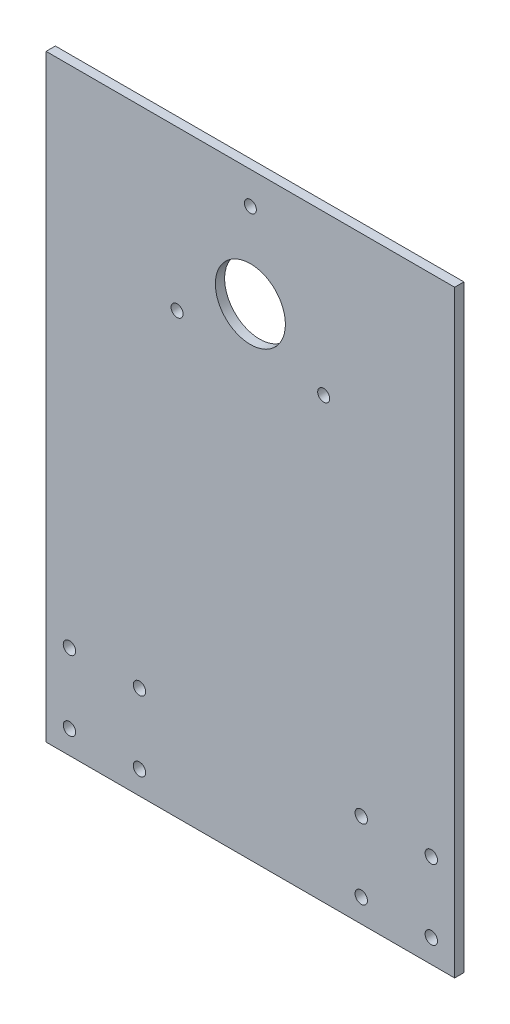
ISO-10303-21;
HEADER;
FILE_DESCRIPTION(('STEP AP214'),'2;1');
FILE_NAME('part.step','',(''),(''),'','','');
FILE_SCHEMA(('AUTOMOTIVE_DESIGN { 1 0 10303 214 1 1 1 1 }'));
ENDSEC;
DATA;
#1=APPLICATION_CONTEXT('core data for automotive mechanical design processes');
#2=APPLICATION_PROTOCOL_DEFINITION('international standard','automotive_design',2000,#1);
#3=PRODUCT_CONTEXT('',#1,'mechanical');
#4=PRODUCT('Part','Part','',(#3));
#5=PRODUCT_RELATED_PRODUCT_CATEGORY('part','',(#4));
#6=PRODUCT_DEFINITION_FORMATION('','',#4);
#7=PRODUCT_DEFINITION_CONTEXT('part definition',#1,'design');
#8=PRODUCT_DEFINITION('design','',#6,#7);
#9=PRODUCT_DEFINITION_SHAPE('','',#8);
#10=(LENGTH_UNIT() NAMED_UNIT(*) SI_UNIT(.MILLI.,.METRE.));
#11=(NAMED_UNIT(*) PLANE_ANGLE_UNIT() SI_UNIT($,.RADIAN.));
#12=(NAMED_UNIT(*) SI_UNIT($,.STERADIAN.) SOLID_ANGLE_UNIT());
#13=UNCERTAINTY_MEASURE_WITH_UNIT(LENGTH_MEASURE(1.E-05),#10,'distance_accuracy_value','');
#14=(GEOMETRIC_REPRESENTATION_CONTEXT(3) GLOBAL_UNCERTAINTY_ASSIGNED_CONTEXT((#13)) GLOBAL_UNIT_ASSIGNED_CONTEXT((#10,
#11,#12)) REPRESENTATION_CONTEXT('',''));
#15=CARTESIAN_POINT('',(0.,0.,0.));
#16=DIRECTION('',(0.,0.,1.));
#17=DIRECTION('',(1.,0.,0.));
#18=AXIS2_PLACEMENT_3D('',#15,#16,#17);
#19=CARTESIAN_POINT('',(0.,0.,3.175));
#20=DIRECTION('',(0.,0.,-1.));
#21=DIRECTION('',(-1.,0.,0.));
#22=AXIS2_PLACEMENT_3D('',#19,#20,#21);
#23=PLANE('',#22);
#24=DIRECTION('',(0.,1.,0.));
#25=VECTOR('',#24,1.);
#26=CARTESIAN_POINT('',(70.,-102.5,3.175));
#27=LINE('',#26,#25);
#28=CARTESIAN_POINT('',(70.,-102.5,3.175));
#29=VERTEX_POINT('',#28);
#30=CARTESIAN_POINT('',(70.,102.5,3.175));
#31=VERTEX_POINT('',#30);
#32=EDGE_CURVE('E98',#29,#31,#27,.T.);
#33=ORIENTED_EDGE('',*,*,#32,.T.);
#34=DIRECTION('',(-1.,0.,0.));
#35=VECTOR('',#34,1.);
#36=CARTESIAN_POINT('',(-70.,102.5,3.175));
#37=LINE('',#36,#35);
#38=CARTESIAN_POINT('',(-70.,102.5,3.175));
#39=VERTEX_POINT('',#38);
#40=EDGE_CURVE('E93',#31,#39,#37,.T.);
#41=ORIENTED_EDGE('',*,*,#40,.T.);
#42=DIRECTION('',(0.,-1.,0.));
#43=VECTOR('',#42,1.);
#44=CARTESIAN_POINT('',(-70.,-102.5,3.175));
#45=LINE('',#44,#43);
#46=CARTESIAN_POINT('',(-70.,-102.5,3.175));
#47=VERTEX_POINT('',#46);
#48=EDGE_CURVE('E96',#39,#47,#45,.T.);
#49=ORIENTED_EDGE('',*,*,#48,.T.);
#50=DIRECTION('',(1.,0.,0.));
#51=VECTOR('',#50,1.);
#52=CARTESIAN_POINT('',(-70.,-102.5,3.175));
#53=LINE('',#52,#51);
#54=EDGE_CURVE('E63',#47,#29,#53,.T.);
#55=ORIENTED_EDGE('',*,*,#54,.T.);
#56=EDGE_LOOP('',(#33,#41,#49,#55));
#57=FACE_BOUND('',#56,.T.);
#58=CARTESIAN_POINT('',(0.,91.5,3.175));
#59=DIRECTION('',(0.,0.,1.));
#60=DIRECTION('',(1.,0.,0.));
#61=AXIS2_PLACEMENT_3D('',#58,#59,#60);
#62=CIRCLE('',#61,2.05);
#63=CARTESIAN_POINT('',(2.05,91.5,3.175));
#64=VERTEX_POINT('',#63);
#65=EDGE_CURVE('E118',#64,#64,#62,.T.);
#66=ORIENTED_EDGE('',*,*,#65,.F.);
#67=EDGE_LOOP('',(#66));
#68=FACE_BOUND('',#67,.T.);
#69=CARTESIAN_POINT('',(-62.,-94.5,3.175));
#70=DIRECTION('',(0.,0.,1.));
#71=DIRECTION('',(1.,0.,0.));
#72=AXIS2_PLACEMENT_3D('',#69,#70,#71);
#73=CIRCLE('',#72,2.125);
#74=CARTESIAN_POINT('',(-59.875,-94.5,3.175));
#75=VERTEX_POINT('',#74);
#76=EDGE_CURVE('E140',#75,#75,#73,.T.);
#77=ORIENTED_EDGE('',*,*,#76,.F.);
#78=EDGE_LOOP('',(#77));
#79=FACE_BOUND('',#78,.T.);
#80=CARTESIAN_POINT('',(25.1147367097487,48.,3.175));
#81=DIRECTION('',(0.,0.,1.));
#82=DIRECTION('',(1.,0.,0.));
#83=AXIS2_PLACEMENT_3D('',#80,#81,#82);
#84=CIRCLE('',#83,2.04999999999999);
#85=CARTESIAN_POINT('',(27.1647367097487,48.,3.175));
#86=VERTEX_POINT('',#85);
#87=EDGE_CURVE('E148',#86,#86,#84,.T.);
#88=ORIENTED_EDGE('',*,*,#87,.F.);
#89=EDGE_LOOP('',(#88));
#90=FACE_BOUND('',#89,.T.);
#91=CARTESIAN_POINT('',(-25.1147367097487,48.,3.175));
#92=DIRECTION('',(0.,0.,1.));
#93=DIRECTION('',(1.,0.,0.));
#94=AXIS2_PLACEMENT_3D('',#91,#92,#93);
#95=CIRCLE('',#94,2.04999999999999);
#96=CARTESIAN_POINT('',(-23.0647367097487,48.,3.175));
#97=VERTEX_POINT('',#96);
#98=EDGE_CURVE('E156',#97,#97,#95,.T.);
#99=ORIENTED_EDGE('',*,*,#98,.F.);
#100=EDGE_LOOP('',(#99));
#101=FACE_BOUND('',#100,.T.);
#102=CARTESIAN_POINT('',(-38.,-94.5,3.175));
#103=DIRECTION('',(0.,0.,1.));
#104=DIRECTION('',(-1.,0.,0.));
#105=AXIS2_PLACEMENT_3D('',#102,#103,#104);
#106=CIRCLE('',#105,2.125);
#107=CARTESIAN_POINT('',(-40.125,-94.5,3.175));
#108=VERTEX_POINT('',#107);
#109=EDGE_CURVE('E164',#108,#108,#106,.T.);
#110=ORIENTED_EDGE('',*,*,#109,.F.);
#111=EDGE_LOOP('',(#110));
#112=FACE_BOUND('',#111,.T.);
#113=CARTESIAN_POINT('',(-38.,-70.5,3.175));
#114=DIRECTION('',(0.,0.,1.));
#115=DIRECTION('',(1.,0.,0.));
#116=AXIS2_PLACEMENT_3D('',#113,#114,#115);
#117=CIRCLE('',#116,2.125);
#118=CARTESIAN_POINT('',(-35.875,-70.5,3.175));
#119=VERTEX_POINT('',#118);
#120=EDGE_CURVE('E172',#119,#119,#117,.T.);
#121=ORIENTED_EDGE('',*,*,#120,.F.);
#122=EDGE_LOOP('',(#121));
#123=FACE_BOUND('',#122,.T.);
#124=CARTESIAN_POINT('',(-62.,-70.5,3.175));
#125=DIRECTION('',(0.,0.,1.));
#126=DIRECTION('',(-1.,0.,0.));
#127=AXIS2_PLACEMENT_3D('',#124,#125,#126);
#128=CIRCLE('',#127,2.125);
#129=CARTESIAN_POINT('',(-64.125,-70.5,3.175));
#130=VERTEX_POINT('',#129);
#131=EDGE_CURVE('E180',#130,#130,#128,.T.);
#132=ORIENTED_EDGE('',*,*,#131,.F.);
#133=EDGE_LOOP('',(#132));
#134=FACE_BOUND('',#133,.T.);
#135=CARTESIAN_POINT('',(38.0000000000001,-94.5,3.175));
#136=DIRECTION('',(0.,0.,1.));
#137=DIRECTION('',(1.,0.,0.));
#138=AXIS2_PLACEMENT_3D('',#135,#136,#137);
#139=CIRCLE('',#138,2.125);
#140=CARTESIAN_POINT('',(40.1250000000001,-94.5,3.175));
#141=VERTEX_POINT('',#140);
#142=EDGE_CURVE('E188',#141,#141,#139,.T.);
#143=ORIENTED_EDGE('',*,*,#142,.F.);
#144=EDGE_LOOP('',(#143));
#145=FACE_BOUND('',#144,.T.);
#146=CARTESIAN_POINT('',(62.0000000000001,-94.5,3.175));
#147=DIRECTION('',(0.,0.,1.));
#148=DIRECTION('',(-1.,0.,0.));
#149=AXIS2_PLACEMENT_3D('',#146,#147,#148);
#150=CIRCLE('',#149,2.12500000000001);
#151=CARTESIAN_POINT('',(59.875,-94.5,3.175));
#152=VERTEX_POINT('',#151);
#153=EDGE_CURVE('E196',#152,#152,#150,.T.);
#154=ORIENTED_EDGE('',*,*,#153,.F.);
#155=EDGE_LOOP('',(#154));
#156=FACE_BOUND('',#155,.T.);
#157=CARTESIAN_POINT('',(62.0000000000001,-70.5,3.175));
#158=DIRECTION('',(0.,0.,1.));
#159=DIRECTION('',(1.,0.,0.));
#160=AXIS2_PLACEMENT_3D('',#157,#158,#159);
#161=CIRCLE('',#160,2.12500000000001);
#162=CARTESIAN_POINT('',(64.1250000000001,-70.5,3.175));
#163=VERTEX_POINT('',#162);
#164=EDGE_CURVE('E204',#163,#163,#161,.T.);
#165=ORIENTED_EDGE('',*,*,#164,.F.);
#166=EDGE_LOOP('',(#165));
#167=FACE_BOUND('',#166,.T.);
#168=CARTESIAN_POINT('',(38.0000000000001,-70.5,3.175));
#169=DIRECTION('',(0.,0.,1.));
#170=DIRECTION('',(-1.,0.,0.));
#171=AXIS2_PLACEMENT_3D('',#168,#169,#170);
#172=CIRCLE('',#171,2.125);
#173=CARTESIAN_POINT('',(35.8750000000001,-70.5,3.175));
#174=VERTEX_POINT('',#173);
#175=EDGE_CURVE('E212',#174,#174,#172,.T.);
#176=ORIENTED_EDGE('',*,*,#175,.F.);
#177=EDGE_LOOP('',(#176));
#178=FACE_BOUND('',#177,.T.);
#179=CARTESIAN_POINT('',(0.,62.5,3.175));
#180=DIRECTION('',(0.,0.,1.));
#181=DIRECTION('',(1.,0.,0.));
#182=AXIS2_PLACEMENT_3D('',#179,#180,#181);
#183=CIRCLE('',#182,12.);
#184=CARTESIAN_POINT('',(12.,62.5,3.175));
#185=VERTEX_POINT('',#184);
#186=EDGE_CURVE('E220',#185,#185,#183,.T.);
#187=ORIENTED_EDGE('',*,*,#186,.F.);
#188=EDGE_LOOP('',(#187));
#189=FACE_BOUND('',#188,.T.);
#190=ADVANCED_FACE('F45',(#57,#68,#79,#90,#101,#112,#123,#134,#145,#156,#167,#178,#189),#23,.F.);
#191=CARTESIAN_POINT('',(0.,0.,0.));
#192=DIRECTION('',(0.,0.,-1.));
#193=DIRECTION('',(-1.,0.,0.));
#194=AXIS2_PLACEMENT_3D('',#191,#192,#193);
#195=PLANE('',#194);
#196=CARTESIAN_POINT('',(38.0000000000001,-70.5,0.));
#197=DIRECTION('',(0.,0.,1.));
#198=DIRECTION('',(-1.,0.,0.));
#199=AXIS2_PLACEMENT_3D('',#196,#197,#198);
#200=CIRCLE('',#199,2.125);
#201=CARTESIAN_POINT('',(35.8750000000001,-70.5,0.));
#202=VERTEX_POINT('',#201);
#203=EDGE_CURVE('E216',#202,#202,#200,.T.);
#204=ORIENTED_EDGE('',*,*,#203,.T.);
#205=EDGE_LOOP('',(#204));
#206=FACE_BOUND('',#205,.T.);
#207=CARTESIAN_POINT('',(62.0000000000001,-94.5,0.));
#208=DIRECTION('',(0.,0.,1.));
#209=DIRECTION('',(-1.,0.,0.));
#210=AXIS2_PLACEMENT_3D('',#207,#208,#209);
#211=CIRCLE('',#210,2.12500000000001);
#212=CARTESIAN_POINT('',(59.875,-94.5,0.));
#213=VERTEX_POINT('',#212);
#214=EDGE_CURVE('E200',#213,#213,#211,.T.);
#215=ORIENTED_EDGE('',*,*,#214,.T.);
#216=EDGE_LOOP('',(#215));
#217=FACE_BOUND('',#216,.T.);
#218=CARTESIAN_POINT('',(-62.,-70.5,0.));
#219=DIRECTION('',(0.,0.,1.));
#220=DIRECTION('',(-1.,0.,0.));
#221=AXIS2_PLACEMENT_3D('',#218,#219,#220);
#222=CIRCLE('',#221,2.125);
#223=CARTESIAN_POINT('',(-64.125,-70.5,0.));
#224=VERTEX_POINT('',#223);
#225=EDGE_CURVE('E184',#224,#224,#222,.T.);
#226=ORIENTED_EDGE('',*,*,#225,.T.);
#227=EDGE_LOOP('',(#226));
#228=FACE_BOUND('',#227,.T.);
#229=CARTESIAN_POINT('',(-38.,-94.5,0.));
#230=DIRECTION('',(0.,0.,1.));
#231=DIRECTION('',(-1.,0.,0.));
#232=AXIS2_PLACEMENT_3D('',#229,#230,#231);
#233=CIRCLE('',#232,2.125);
#234=CARTESIAN_POINT('',(-40.125,-94.5,0.));
#235=VERTEX_POINT('',#234);
#236=EDGE_CURVE('E168',#235,#235,#233,.T.);
#237=ORIENTED_EDGE('',*,*,#236,.T.);
#238=EDGE_LOOP('',(#237));
#239=FACE_BOUND('',#238,.T.);
#240=CARTESIAN_POINT('',(25.1147367097487,48.,0.));
#241=DIRECTION('',(0.,0.,1.));
#242=DIRECTION('',(1.,0.,0.));
#243=AXIS2_PLACEMENT_3D('',#240,#241,#242);
#244=CIRCLE('',#243,2.04999999999999);
#245=CARTESIAN_POINT('',(27.1647367097487,48.,0.));
#246=VERTEX_POINT('',#245);
#247=EDGE_CURVE('E152',#246,#246,#244,.T.);
#248=ORIENTED_EDGE('',*,*,#247,.T.);
#249=EDGE_LOOP('',(#248));
#250=FACE_BOUND('',#249,.T.);
#251=CARTESIAN_POINT('',(0.,91.5,0.));
#252=DIRECTION('',(0.,0.,1.));
#253=DIRECTION('',(1.,0.,0.));
#254=AXIS2_PLACEMENT_3D('',#251,#252,#253);
#255=CIRCLE('',#254,2.05);
#256=CARTESIAN_POINT('',(2.05,91.5,0.));
#257=VERTEX_POINT('',#256);
#258=EDGE_CURVE('E136',#257,#257,#255,.T.);
#259=ORIENTED_EDGE('',*,*,#258,.T.);
#260=EDGE_LOOP('',(#259));
#261=FACE_BOUND('',#260,.T.);
#262=DIRECTION('',(0.,1.,0.));
#263=VECTOR('',#262,1.);
#264=CARTESIAN_POINT('',(70.,-102.5,0.));
#265=LINE('',#264,#263);
#266=CARTESIAN_POINT('',(70.,-102.5,0.));
#267=VERTEX_POINT('',#266);
#268=CARTESIAN_POINT('',(70.,102.5,0.));
#269=VERTEX_POINT('',#268);
#270=EDGE_CURVE('E114',#267,#269,#265,.T.);
#271=ORIENTED_EDGE('',*,*,#270,.F.);
#272=DIRECTION('',(1.,0.,0.));
#273=VECTOR('',#272,1.);
#274=CARTESIAN_POINT('',(-70.,-102.5,0.));
#275=LINE('',#274,#273);
#276=CARTESIAN_POINT('',(-70.,-102.5,0.));
#277=VERTEX_POINT('',#276);
#278=EDGE_CURVE('E86',#277,#267,#275,.T.);
#279=ORIENTED_EDGE('',*,*,#278,.F.);
#280=DIRECTION('',(0.,-1.,0.));
#281=VECTOR('',#280,1.);
#282=CARTESIAN_POINT('',(-70.,-102.5,0.));
#283=LINE('',#282,#281);
#284=CARTESIAN_POINT('',(-70.,102.5,0.));
#285=VERTEX_POINT('',#284);
#286=EDGE_CURVE('E80',#285,#277,#283,.T.);
#287=ORIENTED_EDGE('',*,*,#286,.F.);
#288=DIRECTION('',(-1.,0.,0.));
#289=VECTOR('',#288,1.);
#290=CARTESIAN_POINT('',(-70.,102.5,0.));
#291=LINE('',#290,#289);
#292=EDGE_CURVE('E103',#269,#285,#291,.T.);
#293=ORIENTED_EDGE('',*,*,#292,.F.);
#294=EDGE_LOOP('',(#271,#279,#287,#293));
#295=FACE_BOUND('',#294,.T.);
#296=CARTESIAN_POINT('',(-62.,-94.5,0.));
#297=DIRECTION('',(0.,0.,1.));
#298=DIRECTION('',(1.,0.,0.));
#299=AXIS2_PLACEMENT_3D('',#296,#297,#298);
#300=CIRCLE('',#299,2.125);
#301=CARTESIAN_POINT('',(-59.875,-94.5,0.));
#302=VERTEX_POINT('',#301);
#303=EDGE_CURVE('E144',#302,#302,#300,.T.);
#304=ORIENTED_EDGE('',*,*,#303,.T.);
#305=EDGE_LOOP('',(#304));
#306=FACE_BOUND('',#305,.T.);
#307=CARTESIAN_POINT('',(-25.1147367097487,48.,0.));
#308=DIRECTION('',(0.,0.,1.));
#309=DIRECTION('',(1.,0.,0.));
#310=AXIS2_PLACEMENT_3D('',#307,#308,#309);
#311=CIRCLE('',#310,2.04999999999999);
#312=CARTESIAN_POINT('',(-23.0647367097487,48.,0.));
#313=VERTEX_POINT('',#312);
#314=EDGE_CURVE('E160',#313,#313,#311,.T.);
#315=ORIENTED_EDGE('',*,*,#314,.T.);
#316=EDGE_LOOP('',(#315));
#317=FACE_BOUND('',#316,.T.);
#318=CARTESIAN_POINT('',(-38.,-70.5,0.));
#319=DIRECTION('',(0.,0.,1.));
#320=DIRECTION('',(1.,0.,0.));
#321=AXIS2_PLACEMENT_3D('',#318,#319,#320);
#322=CIRCLE('',#321,2.125);
#323=CARTESIAN_POINT('',(-35.875,-70.5,0.));
#324=VERTEX_POINT('',#323);
#325=EDGE_CURVE('E176',#324,#324,#322,.T.);
#326=ORIENTED_EDGE('',*,*,#325,.T.);
#327=EDGE_LOOP('',(#326));
#328=FACE_BOUND('',#327,.T.);
#329=CARTESIAN_POINT('',(38.0000000000001,-94.5,0.));
#330=DIRECTION('',(0.,0.,1.));
#331=DIRECTION('',(1.,0.,0.));
#332=AXIS2_PLACEMENT_3D('',#329,#330,#331);
#333=CIRCLE('',#332,2.125);
#334=CARTESIAN_POINT('',(40.1250000000001,-94.5,0.));
#335=VERTEX_POINT('',#334);
#336=EDGE_CURVE('E192',#335,#335,#333,.T.);
#337=ORIENTED_EDGE('',*,*,#336,.T.);
#338=EDGE_LOOP('',(#337));
#339=FACE_BOUND('',#338,.T.);
#340=CARTESIAN_POINT('',(62.0000000000001,-70.5,0.));
#341=DIRECTION('',(0.,0.,1.));
#342=DIRECTION('',(1.,0.,0.));
#343=AXIS2_PLACEMENT_3D('',#340,#341,#342);
#344=CIRCLE('',#343,2.12500000000001);
#345=CARTESIAN_POINT('',(64.1250000000001,-70.5,0.));
#346=VERTEX_POINT('',#345);
#347=EDGE_CURVE('E208',#346,#346,#344,.T.);
#348=ORIENTED_EDGE('',*,*,#347,.T.);
#349=EDGE_LOOP('',(#348));
#350=FACE_BOUND('',#349,.T.);
#351=CARTESIAN_POINT('',(0.,62.5,0.));
#352=DIRECTION('',(0.,0.,1.));
#353=DIRECTION('',(1.,0.,0.));
#354=AXIS2_PLACEMENT_3D('',#351,#352,#353);
#355=CIRCLE('',#354,12.);
#356=CARTESIAN_POINT('',(12.,62.5,0.));
#357=VERTEX_POINT('',#356);
#358=EDGE_CURVE('E224',#357,#357,#355,.T.);
#359=ORIENTED_EDGE('',*,*,#358,.T.);
#360=EDGE_LOOP('',(#359));
#361=FACE_BOUND('',#360,.T.);
#362=ADVANCED_FACE('F131',(#206,#217,#228,#239,#250,#261,#295,#306,#317,#328,#339,#350,#361),
#195,.T.);
#363=CARTESIAN_POINT('',(70.,-102.5,3.175));
#364=DIRECTION('',(-1.,0.,0.));
#365=DIRECTION('',(0.,-1.,0.));
#366=AXIS2_PLACEMENT_3D('',#363,#364,#365);
#367=PLANE('',#366);
#368=ORIENTED_EDGE('',*,*,#270,.T.);
#369=DIRECTION('',(0.,0.,-1.));
#370=VECTOR('',#369,1.);
#371=CARTESIAN_POINT('',(70.,102.5,3.175));
#372=LINE('',#371,#370);
#373=EDGE_CURVE('E11',#31,#269,#372,.T.);
#374=ORIENTED_EDGE('',*,*,#373,.F.);
#375=ORIENTED_EDGE('',*,*,#32,.F.);
#376=DIRECTION('',(0.,0.,-1.));
#377=VECTOR('',#376,1.);
#378=CARTESIAN_POINT('',(70.,-102.5,3.175));
#379=LINE('',#378,#377);
#380=EDGE_CURVE('E110',#29,#267,#379,.T.);
#381=ORIENTED_EDGE('',*,*,#380,.T.);
#382=EDGE_LOOP('',(#368,#374,#375,#381));
#383=FACE_BOUND('',#382,.T.);
#384=ADVANCED_FACE('F47',(#383),#367,.F.);
#385=CARTESIAN_POINT('',(-70.,102.5,3.175));
#386=DIRECTION('',(0.,-1.,0.));
#387=DIRECTION('',(1.,0.,0.));
#388=AXIS2_PLACEMENT_3D('',#385,#386,#387);
#389=PLANE('',#388);
#390=ORIENTED_EDGE('',*,*,#292,.T.);
#391=DIRECTION('',(0.,0.,-1.));
#392=VECTOR('',#391,1.);
#393=CARTESIAN_POINT('',(-70.,102.5,3.175));
#394=LINE('',#393,#392);
#395=EDGE_CURVE('E55',#39,#285,#394,.T.);
#396=ORIENTED_EDGE('',*,*,#395,.F.);
#397=ORIENTED_EDGE('',*,*,#40,.F.);
#398=ORIENTED_EDGE('',*,*,#373,.T.);
#399=EDGE_LOOP('',(#390,#396,#397,#398));
#400=FACE_BOUND('',#399,.T.);
#401=ADVANCED_FACE('F102',(#400),#389,.F.);
#402=CARTESIAN_POINT('',(-70.,-102.5,3.175));
#403=DIRECTION('',(1.,0.,0.));
#404=DIRECTION('',(0.,0.,-1.));
#405=AXIS2_PLACEMENT_3D('',#402,#403,#404);
#406=PLANE('',#405);
#407=ORIENTED_EDGE('',*,*,#286,.T.);
#408=DIRECTION('',(0.,0.,-1.));
#409=VECTOR('',#408,1.);
#410=CARTESIAN_POINT('',(-70.,-102.5,3.175));
#411=LINE('',#410,#409);
#412=EDGE_CURVE('E105',#47,#277,#411,.T.);
#413=ORIENTED_EDGE('',*,*,#412,.F.);
#414=ORIENTED_EDGE('',*,*,#48,.F.);
#415=ORIENTED_EDGE('',*,*,#395,.T.);
#416=EDGE_LOOP('',(#407,#413,#414,#415));
#417=FACE_BOUND('',#416,.T.);
#418=ADVANCED_FACE('F106',(#417),#406,.F.);
#419=CARTESIAN_POINT('',(-70.,-102.5,3.175));
#420=DIRECTION('',(0.,1.,0.));
#421=DIRECTION('',(-1.,0.,0.));
#422=AXIS2_PLACEMENT_3D('',#419,#420,#421);
#423=PLANE('',#422);
#424=ORIENTED_EDGE('',*,*,#278,.T.);
#425=ORIENTED_EDGE('',*,*,#380,.F.);
#426=ORIENTED_EDGE('',*,*,#54,.F.);
#427=ORIENTED_EDGE('',*,*,#412,.T.);
#428=EDGE_LOOP('',(#424,#425,#426,#427));
#429=FACE_BOUND('',#428,.T.);
#430=ADVANCED_FACE('F128',(#429),#423,.F.);
#431=CARTESIAN_POINT('',(0.,91.5,3.175));
#432=DIRECTION('',(0.,0.,-1.));
#433=DIRECTION('',(-1.,0.,0.));
#434=AXIS2_PLACEMENT_3D('',#431,#432,#433);
#435=CYLINDRICAL_SURFACE('',#434,2.05);
#436=ORIENTED_EDGE('',*,*,#65,.T.);
#437=EDGE_LOOP('',(#436));
#438=FACE_BOUND('',#437,.T.);
#439=ORIENTED_EDGE('',*,*,#258,.F.);
#440=EDGE_LOOP('',(#439));
#441=FACE_BOUND('',#440,.T.);
#442=ADVANCED_FACE('F243',(#438,#441),#435,.F.);
#443=CARTESIAN_POINT('',(-62.,-94.5,3.175));
#444=DIRECTION('',(0.,0.,-1.));
#445=DIRECTION('',(-1.,0.,0.));
#446=AXIS2_PLACEMENT_3D('',#443,#444,#445);
#447=CYLINDRICAL_SURFACE('',#446,2.125);
#448=ORIENTED_EDGE('',*,*,#76,.T.);
#449=EDGE_LOOP('',(#448));
#450=FACE_BOUND('',#449,.T.);
#451=ORIENTED_EDGE('',*,*,#303,.F.);
#452=EDGE_LOOP('',(#451));
#453=FACE_BOUND('',#452,.T.);
#454=ADVANCED_FACE('F288',(#450,#453),#447,.F.);
#455=CARTESIAN_POINT('',(25.1147367097487,48.,3.175));
#456=DIRECTION('',(0.,0.,-1.));
#457=DIRECTION('',(-1.,0.,0.));
#458=AXIS2_PLACEMENT_3D('',#455,#456,#457);
#459=CYLINDRICAL_SURFACE('',#458,2.04999999999999);
#460=ORIENTED_EDGE('',*,*,#87,.T.);
#461=EDGE_LOOP('',(#460));
#462=FACE_BOUND('',#461,.T.);
#463=ORIENTED_EDGE('',*,*,#247,.F.);
#464=EDGE_LOOP('',(#463));
#465=FACE_BOUND('',#464,.T.);
#466=ADVANCED_FACE('F296',(#462,#465),#459,.F.);
#467=CARTESIAN_POINT('',(-25.1147367097487,48.,3.175));
#468=DIRECTION('',(0.,0.,-1.));
#469=DIRECTION('',(-1.,0.,0.));
#470=AXIS2_PLACEMENT_3D('',#467,#468,#469);
#471=CYLINDRICAL_SURFACE('',#470,2.04999999999999);
#472=ORIENTED_EDGE('',*,*,#98,.T.);
#473=EDGE_LOOP('',(#472));
#474=FACE_BOUND('',#473,.T.);
#475=ORIENTED_EDGE('',*,*,#314,.F.);
#476=EDGE_LOOP('',(#475));
#477=FACE_BOUND('',#476,.T.);
#478=ADVANCED_FACE('F304',(#474,#477),#471,.F.);
#479=CARTESIAN_POINT('',(-38.,-94.5,3.175));
#480=DIRECTION('',(0.,0.,-1.));
#481=DIRECTION('',(-1.,0.,0.));
#482=AXIS2_PLACEMENT_3D('',#479,#480,#481);
#483=CYLINDRICAL_SURFACE('',#482,2.125);
#484=ORIENTED_EDGE('',*,*,#109,.T.);
#485=EDGE_LOOP('',(#484));
#486=FACE_BOUND('',#485,.T.);
#487=ORIENTED_EDGE('',*,*,#236,.F.);
#488=EDGE_LOOP('',(#487));
#489=FACE_BOUND('',#488,.T.);
#490=ADVANCED_FACE('F313',(#486,#489),#483,.F.);
#491=CARTESIAN_POINT('',(-38.,-70.5,3.175));
#492=DIRECTION('',(0.,0.,-1.));
#493=DIRECTION('',(-1.,0.,0.));
#494=AXIS2_PLACEMENT_3D('',#491,#492,#493);
#495=CYLINDRICAL_SURFACE('',#494,2.125);
#496=ORIENTED_EDGE('',*,*,#120,.T.);
#497=EDGE_LOOP('',(#496));
#498=FACE_BOUND('',#497,.T.);
#499=ORIENTED_EDGE('',*,*,#325,.F.);
#500=EDGE_LOOP('',(#499));
#501=FACE_BOUND('',#500,.T.);
#502=ADVANCED_FACE('F322',(#498,#501),#495,.F.);
#503=CARTESIAN_POINT('',(-62.,-70.5,3.175));
#504=DIRECTION('',(0.,0.,-1.));
#505=DIRECTION('',(-1.,0.,0.));
#506=AXIS2_PLACEMENT_3D('',#503,#504,#505);
#507=CYLINDRICAL_SURFACE('',#506,2.125);
#508=ORIENTED_EDGE('',*,*,#131,.T.);
#509=EDGE_LOOP('',(#508));
#510=FACE_BOUND('',#509,.T.);
#511=ORIENTED_EDGE('',*,*,#225,.F.);
#512=EDGE_LOOP('',(#511));
#513=FACE_BOUND('',#512,.T.);
#514=ADVANCED_FACE('F331',(#510,#513),#507,.F.);
#515=CARTESIAN_POINT('',(38.0000000000001,-94.5,3.175));
#516=DIRECTION('',(0.,0.,-1.));
#517=DIRECTION('',(-1.,0.,0.));
#518=AXIS2_PLACEMENT_3D('',#515,#516,#517);
#519=CYLINDRICAL_SURFACE('',#518,2.125);
#520=ORIENTED_EDGE('',*,*,#142,.T.);
#521=EDGE_LOOP('',(#520));
#522=FACE_BOUND('',#521,.T.);
#523=ORIENTED_EDGE('',*,*,#336,.F.);
#524=EDGE_LOOP('',(#523));
#525=FACE_BOUND('',#524,.T.);
#526=ADVANCED_FACE('F340',(#522,#525),#519,.F.);
#527=CARTESIAN_POINT('',(62.0000000000001,-94.5,3.175));
#528=DIRECTION('',(0.,0.,-1.));
#529=DIRECTION('',(-1.,0.,0.));
#530=AXIS2_PLACEMENT_3D('',#527,#528,#529);
#531=CYLINDRICAL_SURFACE('',#530,2.12500000000001);
#532=ORIENTED_EDGE('',*,*,#153,.T.);
#533=EDGE_LOOP('',(#532));
#534=FACE_BOUND('',#533,.T.);
#535=ORIENTED_EDGE('',*,*,#214,.F.);
#536=EDGE_LOOP('',(#535));
#537=FACE_BOUND('',#536,.T.);
#538=ADVANCED_FACE('F349',(#534,#537),#531,.F.);
#539=CARTESIAN_POINT('',(62.0000000000001,-70.5,3.175));
#540=DIRECTION('',(0.,0.,-1.));
#541=DIRECTION('',(-1.,0.,0.));
#542=AXIS2_PLACEMENT_3D('',#539,#540,#541);
#543=CYLINDRICAL_SURFACE('',#542,2.12500000000001);
#544=ORIENTED_EDGE('',*,*,#164,.T.);
#545=EDGE_LOOP('',(#544));
#546=FACE_BOUND('',#545,.T.);
#547=ORIENTED_EDGE('',*,*,#347,.F.);
#548=EDGE_LOOP('',(#547));
#549=FACE_BOUND('',#548,.T.);
#550=ADVANCED_FACE('F358',(#546,#549),#543,.F.);
#551=CARTESIAN_POINT('',(38.0000000000001,-70.5,3.175));
#552=DIRECTION('',(0.,0.,-1.));
#553=DIRECTION('',(-1.,0.,0.));
#554=AXIS2_PLACEMENT_3D('',#551,#552,#553);
#555=CYLINDRICAL_SURFACE('',#554,2.125);
#556=ORIENTED_EDGE('',*,*,#175,.T.);
#557=EDGE_LOOP('',(#556));
#558=FACE_BOUND('',#557,.T.);
#559=ORIENTED_EDGE('',*,*,#203,.F.);
#560=EDGE_LOOP('',(#559));
#561=FACE_BOUND('',#560,.T.);
#562=ADVANCED_FACE('F367',(#558,#561),#555,.F.);
#563=CARTESIAN_POINT('',(0.,62.5,3.175));
#564=DIRECTION('',(0.,0.,-1.));
#565=DIRECTION('',(-1.,0.,0.));
#566=AXIS2_PLACEMENT_3D('',#563,#564,#565);
#567=CYLINDRICAL_SURFACE('',#566,12.);
#568=ORIENTED_EDGE('',*,*,#186,.T.);
#569=EDGE_LOOP('',(#568));
#570=FACE_BOUND('',#569,.T.);
#571=ORIENTED_EDGE('',*,*,#358,.F.);
#572=EDGE_LOOP('',(#571));
#573=FACE_BOUND('',#572,.T.);
#574=ADVANCED_FACE('F232',(#570,#573),#567,.F.);
#575=CLOSED_SHELL('',(#190,#362,#384,#401,#418,#430,#442,#454,#466,#478,#490,#502,#514,#526,
#538,#550,#562,#574));
#576=MANIFOLD_SOLID_BREP('B2',#575);
#577=ADVANCED_BREP_SHAPE_REPRESENTATION('',(#18,#576),#14);
#578=SHAPE_DEFINITION_REPRESENTATION(#9,#577);
ENDSEC;
END-ISO-10303-21;
